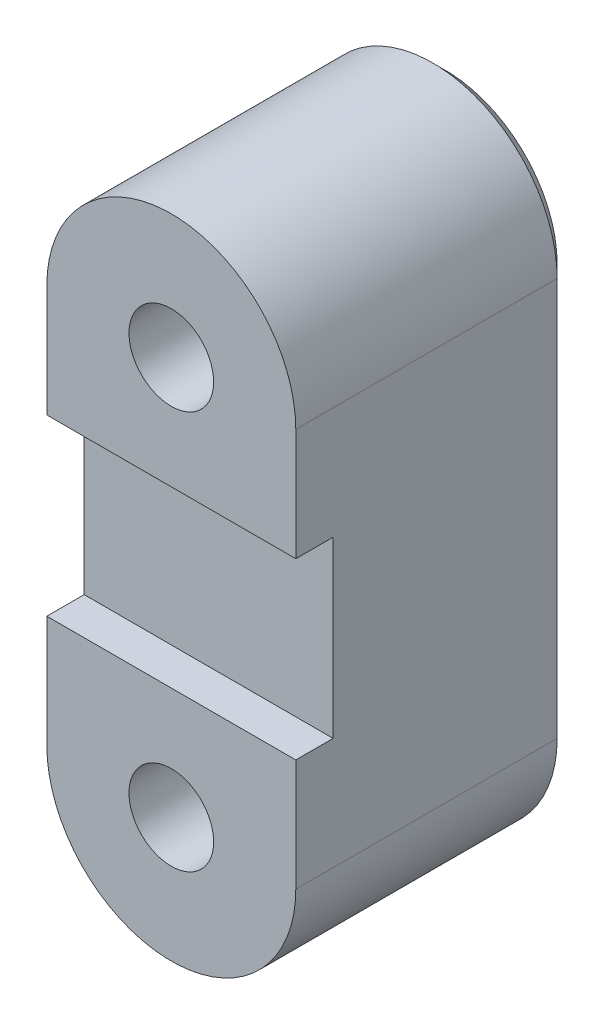
ISO-10303-21;
HEADER;
FILE_DESCRIPTION(('STEP AP214'),'2;1');
FILE_NAME('part.step','',(''),(''),'','','');
FILE_SCHEMA(('AUTOMOTIVE_DESIGN { 1 0 10303 214 1 1 1 1 }'));
ENDSEC;
DATA;
#1=APPLICATION_CONTEXT('core data for automotive mechanical design processes');
#2=APPLICATION_PROTOCOL_DEFINITION('international standard','automotive_design',2000,#1);
#3=PRODUCT_CONTEXT('',#1,'mechanical');
#4=PRODUCT('Part','Part','',(#3));
#5=PRODUCT_RELATED_PRODUCT_CATEGORY('part','',(#4));
#6=PRODUCT_DEFINITION_FORMATION('','',#4);
#7=PRODUCT_DEFINITION_CONTEXT('part definition',#1,'design');
#8=PRODUCT_DEFINITION('design','',#6,#7);
#9=PRODUCT_DEFINITION_SHAPE('','',#8);
#10=(LENGTH_UNIT() NAMED_UNIT(*) SI_UNIT(.MILLI.,.METRE.));
#11=(NAMED_UNIT(*) PLANE_ANGLE_UNIT() SI_UNIT($,.RADIAN.));
#12=(NAMED_UNIT(*) SI_UNIT($,.STERADIAN.) SOLID_ANGLE_UNIT());
#13=UNCERTAINTY_MEASURE_WITH_UNIT(LENGTH_MEASURE(1.E-05),#10,'distance_accuracy_value','');
#14=(GEOMETRIC_REPRESENTATION_CONTEXT(3) GLOBAL_UNCERTAINTY_ASSIGNED_CONTEXT((#13)) GLOBAL_UNIT_ASSIGNED_CONTEXT((#10,
#11,#12)) REPRESENTATION_CONTEXT('',''));
#15=CARTESIAN_POINT('',(0.,0.,0.));
#16=DIRECTION('',(0.,0.,1.));
#17=DIRECTION('',(1.,0.,0.));
#18=AXIS2_PLACEMENT_3D('',#15,#16,#17);
#19=CARTESIAN_POINT('',(0.,-8.,11.));
#20=DIRECTION('',(0.,0.,1.));
#21=DIRECTION('',(1.,0.,0.));
#22=AXIS2_PLACEMENT_3D('',#19,#20,#21);
#23=PLANE('',#22);
#24=DIRECTION('',(-1.,0.,0.));
#25=VECTOR('',#24,1.);
#26=CARTESIAN_POINT('',(-5.,3.5,11.));
#27=LINE('',#26,#25);
#28=CARTESIAN_POINT('',(5.,3.5,11.));
#29=VERTEX_POINT('',#28);
#30=CARTESIAN_POINT('',(-5.,3.5,11.));
#31=VERTEX_POINT('',#30);
#32=EDGE_CURVE('E134',#29,#31,#27,.T.);
#33=ORIENTED_EDGE('',*,*,#32,.F.);
#34=DIRECTION('',(0.,1.,0.));
#35=VECTOR('',#34,1.);
#36=CARTESIAN_POINT('',(5.,-8.,11.));
#37=LINE('',#36,#35);
#38=CARTESIAN_POINT('',(5.,8.,11.));
#39=VERTEX_POINT('',#38);
#40=EDGE_CURVE('E155',#29,#39,#37,.T.);
#41=ORIENTED_EDGE('',*,*,#40,.T.);
#42=CARTESIAN_POINT('',(0.,8.,11.));
#43=DIRECTION('',(0.,0.,1.));
#44=DIRECTION('',(1.,0.,0.));
#45=AXIS2_PLACEMENT_3D('',#42,#43,#44);
#46=CIRCLE('',#45,5.);
#47=CARTESIAN_POINT('',(-5.,8.,11.));
#48=VERTEX_POINT('',#47);
#49=EDGE_CURVE('E159',#39,#48,#46,.T.);
#50=ORIENTED_EDGE('',*,*,#49,.T.);
#51=DIRECTION('',(0.,-1.,0.));
#52=VECTOR('',#51,1.);
#53=CARTESIAN_POINT('',(-5.,-8.,11.));
#54=LINE('',#53,#52);
#55=EDGE_CURVE('E161',#48,#31,#54,.T.);
#56=ORIENTED_EDGE('',*,*,#55,.T.);
#57=EDGE_LOOP('',(#33,#41,#50,#56));
#58=FACE_BOUND('',#57,.T.);
#59=CARTESIAN_POINT('',(0.,8.,11.));
#60=DIRECTION('',(0.,0.,1.));
#61=DIRECTION('',(1.,0.,0.));
#62=AXIS2_PLACEMENT_3D('',#59,#60,#61);
#63=CIRCLE('',#62,1.7);
#64=CARTESIAN_POINT('',(1.7,8.,11.));
#65=VERTEX_POINT('',#64);
#66=EDGE_CURVE('E148',#65,#65,#63,.T.);
#67=ORIENTED_EDGE('',*,*,#66,.F.);
#68=EDGE_LOOP('',(#67));
#69=FACE_BOUND('',#68,.T.);
#70=ADVANCED_FACE('F34',(#58,#69),#23,.T.);
#71=DIRECTION('',(1.,0.,0.));
#72=VECTOR('',#71,1.);
#73=CARTESIAN_POINT('',(-5.,-3.5,11.));
#74=LINE('',#73,#72);
#75=CARTESIAN_POINT('',(-5.,-3.5,11.));
#76=VERTEX_POINT('',#75);
#77=CARTESIAN_POINT('',(5.,-3.5,11.));
#78=VERTEX_POINT('',#77);
#79=EDGE_CURVE('E206',#76,#78,#74,.T.);
#80=ORIENTED_EDGE('',*,*,#79,.F.);
#81=CARTESIAN_POINT('',(-5.,-8.,11.));
#82=VERTEX_POINT('',#81);
#83=EDGE_CURVE('E138',#76,#82,#54,.T.);
#84=ORIENTED_EDGE('',*,*,#83,.T.);
#85=CARTESIAN_POINT('',(0.,-8.,11.));
#86=DIRECTION('',(0.,0.,1.));
#87=DIRECTION('',(1.,0.,0.));
#88=AXIS2_PLACEMENT_3D('',#85,#86,#87);
#89=CIRCLE('',#88,5.);
#90=CARTESIAN_POINT('',(5.,-8.,11.));
#91=VERTEX_POINT('',#90);
#92=EDGE_CURVE('E152',#82,#91,#89,.T.);
#93=ORIENTED_EDGE('',*,*,#92,.T.);
#94=EDGE_CURVE('E156',#91,#78,#37,.T.);
#95=ORIENTED_EDGE('',*,*,#94,.T.);
#96=EDGE_LOOP('',(#80,#84,#93,#95));
#97=FACE_BOUND('',#96,.T.);
#98=CARTESIAN_POINT('',(0.,-8.,11.));
#99=DIRECTION('',(0.,0.,1.));
#100=DIRECTION('',(1.,0.,0.));
#101=AXIS2_PLACEMENT_3D('',#98,#99,#100);
#102=CIRCLE('',#101,1.7);
#103=CARTESIAN_POINT('',(1.7,-8.,11.));
#104=VERTEX_POINT('',#103);
#105=EDGE_CURVE('E145',#104,#104,#102,.T.);
#106=ORIENTED_EDGE('',*,*,#105,.F.);
#107=EDGE_LOOP('',(#106));
#108=FACE_BOUND('',#107,.T.);
#109=ADVANCED_FACE('F239',(#97,#108),#23,.T.);
#110=CARTESIAN_POINT('',(0.,-8.,0.));
#111=DIRECTION('',(0.,0.,1.));
#112=DIRECTION('',(1.,0.,0.));
#113=AXIS2_PLACEMENT_3D('',#110,#111,#112);
#114=PLANE('',#113);
#115=CARTESIAN_POINT('',(0.,8.,0.));
#116=DIRECTION('',(0.,0.,1.));
#117=DIRECTION('',(1.,0.,0.));
#118=AXIS2_PLACEMENT_3D('',#115,#116,#117);
#119=CIRCLE('',#118,4.5);
#120=CARTESIAN_POINT('',(-4.5,8.,0.));
#121=VERTEX_POINT('',#120);
#122=CARTESIAN_POINT('',(4.5,8.,0.));
#123=VERTEX_POINT('',#122);
#124=EDGE_CURVE('E182',#121,#123,#119,.F.);
#125=ORIENTED_EDGE('',*,*,#124,.T.);
#126=DIRECTION('',(0.,-1.,0.));
#127=VECTOR('',#126,1.);
#128=CARTESIAN_POINT('',(4.5,-8.,0.));
#129=LINE('',#128,#127);
#130=CARTESIAN_POINT('',(4.5,-8.,0.));
#131=VERTEX_POINT('',#130);
#132=EDGE_CURVE('E188',#123,#131,#129,.T.);
#133=ORIENTED_EDGE('',*,*,#132,.T.);
#134=CARTESIAN_POINT('',(0.,-8.,0.));
#135=DIRECTION('',(0.,0.,1.));
#136=DIRECTION('',(1.,0.,0.));
#137=AXIS2_PLACEMENT_3D('',#134,#135,#136);
#138=CIRCLE('',#137,4.5);
#139=CARTESIAN_POINT('',(-4.5,-8.,0.));
#140=VERTEX_POINT('',#139);
#141=EDGE_CURVE('E186',#131,#140,#138,.F.);
#142=ORIENTED_EDGE('',*,*,#141,.T.);
#143=DIRECTION('',(0.,1.,0.));
#144=VECTOR('',#143,1.);
#145=CARTESIAN_POINT('',(-4.5,-8.,0.));
#146=LINE('',#145,#144);
#147=EDGE_CURVE('E184',#140,#121,#146,.T.);
#148=ORIENTED_EDGE('',*,*,#147,.T.);
#149=EDGE_LOOP('',(#125,#133,#142,#148));
#150=FACE_BOUND('',#149,.T.);
#151=CARTESIAN_POINT('',(0.,-8.,0.));
#152=DIRECTION('',(0.,0.,1.));
#153=DIRECTION('',(1.,0.,0.));
#154=AXIS2_PLACEMENT_3D('',#151,#152,#153);
#155=CIRCLE('',#154,2.2);
#156=CARTESIAN_POINT('',(2.2,-8.,0.));
#157=VERTEX_POINT('',#156);
#158=EDGE_CURVE('E179',#157,#157,#155,.T.);
#159=ORIENTED_EDGE('',*,*,#158,.T.);
#160=EDGE_LOOP('',(#159));
#161=FACE_BOUND('',#160,.T.);
#162=CARTESIAN_POINT('',(0.,8.,0.));
#163=DIRECTION('',(0.,0.,1.));
#164=DIRECTION('',(1.,0.,0.));
#165=AXIS2_PLACEMENT_3D('',#162,#163,#164);
#166=CIRCLE('',#165,2.2);
#167=CARTESIAN_POINT('',(2.2,8.,0.));
#168=VERTEX_POINT('',#167);
#169=EDGE_CURVE('E176',#168,#168,#166,.T.);
#170=ORIENTED_EDGE('',*,*,#169,.T.);
#171=EDGE_LOOP('',(#170));
#172=FACE_BOUND('',#171,.T.);
#173=ADVANCED_FACE('F242',(#150,#161,#172),#114,.F.);
#174=CARTESIAN_POINT('',(0.,-8.,11.));
#175=DIRECTION('',(0.,0.,-1.));
#176=DIRECTION('',(-1.,0.,0.));
#177=AXIS2_PLACEMENT_3D('',#174,#175,#176);
#178=CYLINDRICAL_SURFACE('',#177,5.);
#179=DIRECTION('',(0.,0.,-1.));
#180=VECTOR('',#179,1.);
#181=CARTESIAN_POINT('',(-5.,-8.,11.));
#182=LINE('',#181,#180);
#183=CARTESIAN_POINT('',(-5.,-8.,0.5));
#184=VERTEX_POINT('',#183);
#185=EDGE_CURVE('E164',#82,#184,#182,.T.);
#186=ORIENTED_EDGE('',*,*,#185,.T.);
#187=CARTESIAN_POINT('',(0.,-8.,0.5));
#188=DIRECTION('',(0.,0.,1.));
#189=DIRECTION('',(1.,0.,0.));
#190=AXIS2_PLACEMENT_3D('',#187,#188,#189);
#191=CIRCLE('',#190,5.);
#192=CARTESIAN_POINT('',(5.,-8.,0.5));
#193=VERTEX_POINT('',#192);
#194=EDGE_CURVE('E191',#184,#193,#191,.T.);
#195=ORIENTED_EDGE('',*,*,#194,.T.);
#196=DIRECTION('',(0.,0.,-1.));
#197=VECTOR('',#196,1.);
#198=CARTESIAN_POINT('',(5.,-8.,11.));
#199=LINE('',#198,#197);
#200=EDGE_CURVE('E170',#91,#193,#199,.T.);
#201=ORIENTED_EDGE('',*,*,#200,.F.);
#202=ORIENTED_EDGE('',*,*,#92,.F.);
#203=EDGE_LOOP('',(#186,#195,#201,#202));
#204=FACE_BOUND('',#203,.T.);
#205=ADVANCED_FACE('F236',(#204),#178,.T.);
#206=CARTESIAN_POINT('',(5.,-8.,11.));
#207=DIRECTION('',(-1.,0.,0.));
#208=DIRECTION('',(0.,0.,1.));
#209=AXIS2_PLACEMENT_3D('',#206,#207,#208);
#210=PLANE('',#209);
#211=ORIENTED_EDGE('',*,*,#200,.T.);
#212=DIRECTION('',(0.,1.,0.));
#213=VECTOR('',#212,1.);
#214=CARTESIAN_POINT('',(5.,-8.,0.5));
#215=LINE('',#214,#213);
#216=CARTESIAN_POINT('',(5.,8.,0.5));
#217=VERTEX_POINT('',#216);
#218=EDGE_CURVE('E173',#193,#217,#215,.T.);
#219=ORIENTED_EDGE('',*,*,#218,.T.);
#220=DIRECTION('',(0.,0.,-1.));
#221=VECTOR('',#220,1.);
#222=CARTESIAN_POINT('',(5.,8.,11.));
#223=LINE('',#222,#221);
#224=EDGE_CURVE('E168',#39,#217,#223,.T.);
#225=ORIENTED_EDGE('',*,*,#224,.F.);
#226=ORIENTED_EDGE('',*,*,#40,.F.);
#227=DIRECTION('',(0.,0.,1.));
#228=VECTOR('',#227,1.);
#229=CARTESIAN_POINT('',(5.,3.5,9.5));
#230=LINE('',#229,#228);
#231=CARTESIAN_POINT('',(5.,3.5,9.5));
#232=VERTEX_POINT('',#231);
#233=EDGE_CURVE('E140',#232,#29,#230,.T.);
#234=ORIENTED_EDGE('',*,*,#233,.F.);
#235=DIRECTION('',(0.,1.,0.));
#236=VECTOR('',#235,1.);
#237=CARTESIAN_POINT('',(5.,-3.5,9.5));
#238=LINE('',#237,#236);
#239=CARTESIAN_POINT('',(5.,-3.5,9.5));
#240=VERTEX_POINT('',#239);
#241=EDGE_CURVE('E125',#240,#232,#238,.T.);
#242=ORIENTED_EDGE('',*,*,#241,.F.);
#243=DIRECTION('',(0.,0.,1.));
#244=VECTOR('',#243,1.);
#245=CARTESIAN_POINT('',(5.,-3.5,9.5));
#246=LINE('',#245,#244);
#247=EDGE_CURVE('E122',#240,#78,#246,.T.);
#248=ORIENTED_EDGE('',*,*,#247,.T.);
#249=ORIENTED_EDGE('',*,*,#94,.F.);
#250=EDGE_LOOP('',(#211,#219,#225,#226,#234,#242,#248,#249));
#251=FACE_BOUND('',#250,.T.);
#252=ADVANCED_FACE('F225',(#251),#210,.F.);
#253=CARTESIAN_POINT('',(0.,8.,11.));
#254=DIRECTION('',(0.,0.,-1.));
#255=DIRECTION('',(-1.,0.,0.));
#256=AXIS2_PLACEMENT_3D('',#253,#254,#255);
#257=CYLINDRICAL_SURFACE('',#256,5.);
#258=ORIENTED_EDGE('',*,*,#224,.T.);
#259=CARTESIAN_POINT('',(0.,8.,0.5));
#260=DIRECTION('',(0.,0.,1.));
#261=DIRECTION('',(1.,0.,0.));
#262=AXIS2_PLACEMENT_3D('',#259,#260,#261);
#263=CIRCLE('',#262,5.);
#264=CARTESIAN_POINT('',(-5.,8.,0.5));
#265=VERTEX_POINT('',#264);
#266=EDGE_CURVE('E51',#217,#265,#263,.T.);
#267=ORIENTED_EDGE('',*,*,#266,.T.);
#268=DIRECTION('',(0.,0.,-1.));
#269=VECTOR('',#268,1.);
#270=CARTESIAN_POINT('',(-5.,8.,11.));
#271=LINE('',#270,#269);
#272=EDGE_CURVE('E166',#48,#265,#271,.T.);
#273=ORIENTED_EDGE('',*,*,#272,.F.);
#274=ORIENTED_EDGE('',*,*,#49,.F.);
#275=EDGE_LOOP('',(#258,#267,#273,#274));
#276=FACE_BOUND('',#275,.T.);
#277=ADVANCED_FACE('F228',(#276),#257,.T.);
#278=CARTESIAN_POINT('',(-5.,-8.,11.));
#279=DIRECTION('',(1.,0.,0.));
#280=DIRECTION('',(0.,0.,-1.));
#281=AXIS2_PLACEMENT_3D('',#278,#279,#280);
#282=PLANE('',#281);
#283=ORIENTED_EDGE('',*,*,#272,.T.);
#284=DIRECTION('',(0.,-1.,0.));
#285=VECTOR('',#284,1.);
#286=CARTESIAN_POINT('',(-5.,-8.,0.5));
#287=LINE('',#286,#285);
#288=EDGE_CURVE('E58',#265,#184,#287,.T.);
#289=ORIENTED_EDGE('',*,*,#288,.T.);
#290=ORIENTED_EDGE('',*,*,#185,.F.);
#291=ORIENTED_EDGE('',*,*,#83,.F.);
#292=DIRECTION('',(0.,0.,1.));
#293=VECTOR('',#292,1.);
#294=CARTESIAN_POINT('',(-5.,-3.5,9.5));
#295=LINE('',#294,#293);
#296=CARTESIAN_POINT('',(-5.,-3.5,9.5));
#297=VERTEX_POINT('',#296);
#298=EDGE_CURVE('E119',#297,#76,#295,.T.);
#299=ORIENTED_EDGE('',*,*,#298,.F.);
#300=DIRECTION('',(0.,-1.,0.));
#301=VECTOR('',#300,1.);
#302=CARTESIAN_POINT('',(-5.,-3.5,9.5));
#303=LINE('',#302,#301);
#304=CARTESIAN_POINT('',(-5.,3.5,9.5));
#305=VERTEX_POINT('',#304);
#306=EDGE_CURVE('E126',#305,#297,#303,.T.);
#307=ORIENTED_EDGE('',*,*,#306,.F.);
#308=DIRECTION('',(0.,0.,1.));
#309=VECTOR('',#308,1.);
#310=CARTESIAN_POINT('',(-5.,3.5,9.5));
#311=LINE('',#310,#309);
#312=EDGE_CURVE('E149',#305,#31,#311,.T.);
#313=ORIENTED_EDGE('',*,*,#312,.T.);
#314=ORIENTED_EDGE('',*,*,#55,.F.);
#315=EDGE_LOOP('',(#283,#289,#290,#291,#299,#307,#313,#314));
#316=FACE_BOUND('',#315,.T.);
#317=ADVANCED_FACE('F137',(#316),#282,.F.);
#318=CARTESIAN_POINT('',(0.,8.,11.));
#319=DIRECTION('',(0.,0.,-1.));
#320=DIRECTION('',(-1.,0.,0.));
#321=AXIS2_PLACEMENT_3D('',#318,#319,#320);
#322=CYLINDRICAL_SURFACE('',#321,1.7);
#323=CARTESIAN_POINT('',(0.,8.,0.5));
#324=DIRECTION('',(0.,0.,1.));
#325=DIRECTION('',(1.,0.,0.));
#326=AXIS2_PLACEMENT_3D('',#323,#324,#325);
#327=CIRCLE('',#326,1.7);
#328=CARTESIAN_POINT('',(1.7,8.,0.5));
#329=VERTEX_POINT('',#328);
#330=EDGE_CURVE('E11',#329,#329,#327,.F.);
#331=ORIENTED_EDGE('',*,*,#330,.T.);
#332=EDGE_LOOP('',(#331));
#333=FACE_BOUND('',#332,.T.);
#334=ORIENTED_EDGE('',*,*,#66,.T.);
#335=EDGE_LOOP('',(#334));
#336=FACE_BOUND('',#335,.T.);
#337=ADVANCED_FACE('F248',(#333,#336),#322,.F.);
#338=CARTESIAN_POINT('',(0.,-8.,11.));
#339=DIRECTION('',(0.,0.,-1.));
#340=DIRECTION('',(-1.,0.,0.));
#341=AXIS2_PLACEMENT_3D('',#338,#339,#340);
#342=CYLINDRICAL_SURFACE('',#341,1.7);
#343=CARTESIAN_POINT('',(0.,-8.,0.5));
#344=DIRECTION('',(0.,0.,1.));
#345=DIRECTION('',(1.,0.,0.));
#346=AXIS2_PLACEMENT_3D('',#343,#344,#345);
#347=CIRCLE('',#346,1.7);
#348=CARTESIAN_POINT('',(1.7,-8.,0.5));
#349=VERTEX_POINT('',#348);
#350=EDGE_CURVE('E43',#349,#349,#347,.F.);
#351=ORIENTED_EDGE('',*,*,#350,.T.);
#352=EDGE_LOOP('',(#351));
#353=FACE_BOUND('',#352,.T.);
#354=ORIENTED_EDGE('',*,*,#105,.T.);
#355=EDGE_LOOP('',(#354));
#356=FACE_BOUND('',#355,.T.);
#357=ADVANCED_FACE('F246',(#353,#356),#342,.F.);
#358=CARTESIAN_POINT('',(-5.,3.5,9.5));
#359=DIRECTION('',(0.,1.,0.));
#360=DIRECTION('',(-1.,0.,0.));
#361=AXIS2_PLACEMENT_3D('',#358,#359,#360);
#362=PLANE('',#361);
#363=ORIENTED_EDGE('',*,*,#32,.T.);
#364=ORIENTED_EDGE('',*,*,#312,.F.);
#365=DIRECTION('',(-1.,0.,0.));
#366=VECTOR('',#365,1.);
#367=CARTESIAN_POINT('',(-5.,3.5,9.5));
#368=LINE('',#367,#366);
#369=EDGE_CURVE('E131',#232,#305,#368,.T.);
#370=ORIENTED_EDGE('',*,*,#369,.F.);
#371=ORIENTED_EDGE('',*,*,#233,.T.);
#372=EDGE_LOOP('',(#363,#364,#370,#371));
#373=FACE_BOUND('',#372,.T.);
#374=ADVANCED_FACE('F218',(#373),#362,.F.);
#375=CARTESIAN_POINT('',(-5.,-3.5,9.5));
#376=DIRECTION('',(0.,-1.,0.));
#377=DIRECTION('',(0.,0.,-1.));
#378=AXIS2_PLACEMENT_3D('',#375,#376,#377);
#379=PLANE('',#378);
#380=ORIENTED_EDGE('',*,*,#79,.T.);
#381=ORIENTED_EDGE('',*,*,#247,.F.);
#382=DIRECTION('',(1.,0.,0.));
#383=VECTOR('',#382,1.);
#384=CARTESIAN_POINT('',(-5.,-3.5,9.5));
#385=LINE('',#384,#383);
#386=EDGE_CURVE('E115',#297,#240,#385,.T.);
#387=ORIENTED_EDGE('',*,*,#386,.F.);
#388=ORIENTED_EDGE('',*,*,#298,.T.);
#389=EDGE_LOOP('',(#380,#381,#387,#388));
#390=FACE_BOUND('',#389,.T.);
#391=ADVANCED_FACE('F117',(#390),#379,.F.);
#392=CARTESIAN_POINT('',(0.,0.,9.5));
#393=DIRECTION('',(0.,0.,-1.));
#394=DIRECTION('',(-1.,0.,0.));
#395=AXIS2_PLACEMENT_3D('',#392,#393,#394);
#396=PLANE('',#395);
#397=ORIENTED_EDGE('',*,*,#306,.T.);
#398=ORIENTED_EDGE('',*,*,#386,.T.);
#399=ORIENTED_EDGE('',*,*,#241,.T.);
#400=ORIENTED_EDGE('',*,*,#369,.T.);
#401=EDGE_LOOP('',(#397,#398,#399,#400));
#402=FACE_BOUND('',#401,.T.);
#403=ADVANCED_FACE('F129',(#402),#396,.F.);
#404=CARTESIAN_POINT('',(-5.,-8.,0.5));
#405=DIRECTION('',(0.707106781186545,0.,0.70710678118655));
#406=DIRECTION('',(0.,-1.,0.));
#407=AXIS2_PLACEMENT_3D('',#404,#405,#406);
#408=PLANE('',#407);
#409=DIRECTION('',(-0.70710678118655,0.,0.707106781186545));
#410=VECTOR('',#409,1.);
#411=CARTESIAN_POINT('',(-4.5,8.,0.));
#412=LINE('',#411,#410);
#413=EDGE_CURVE('E200',#121,#265,#412,.T.);
#414=ORIENTED_EDGE('',*,*,#413,.F.);
#415=ORIENTED_EDGE('',*,*,#147,.F.);
#416=DIRECTION('',(0.70710678118655,0.,-0.707106781186545));
#417=VECTOR('',#416,1.);
#418=CARTESIAN_POINT('',(-5.,-8.,0.5));
#419=LINE('',#418,#417);
#420=EDGE_CURVE('E38',#184,#140,#419,.T.);
#421=ORIENTED_EDGE('',*,*,#420,.F.);
#422=ORIENTED_EDGE('',*,*,#288,.F.);
#423=EDGE_LOOP('',(#414,#415,#421,#422));
#424=FACE_BOUND('',#423,.T.);
#425=ADVANCED_FACE('F230',(#424),#408,.F.);
#426=CARTESIAN_POINT('',(0.,-8.,0.5));
#427=DIRECTION('',(0.,0.,1.));
#428=DIRECTION('',(1.,0.,0.));
#429=AXIS2_PLACEMENT_3D('',#426,#427,#428);
#430=CONICAL_SURFACE('',#429,5.,0.785398163397452);
#431=ORIENTED_EDGE('',*,*,#420,.T.);
#432=ORIENTED_EDGE('',*,*,#141,.F.);
#433=DIRECTION('',(-0.70710678118655,0.,-0.707106781186545));
#434=VECTOR('',#433,1.);
#435=CARTESIAN_POINT('',(5.,-8.,0.5));
#436=LINE('',#435,#434);
#437=EDGE_CURVE('E199',#193,#131,#436,.T.);
#438=ORIENTED_EDGE('',*,*,#437,.F.);
#439=ORIENTED_EDGE('',*,*,#194,.F.);
#440=EDGE_LOOP('',(#431,#432,#438,#439));
#441=FACE_BOUND('',#440,.T.);
#442=ADVANCED_FACE('F233',(#441),#430,.T.);
#443=CARTESIAN_POINT('',(0.,8.,0.5));
#444=DIRECTION('',(0.,0.,1.));
#445=DIRECTION('',(1.,0.,0.));
#446=AXIS2_PLACEMENT_3D('',#443,#444,#445);
#447=CONICAL_SURFACE('',#446,5.,0.785398163397452);
#448=ORIENTED_EDGE('',*,*,#413,.T.);
#449=ORIENTED_EDGE('',*,*,#266,.F.);
#450=DIRECTION('',(0.70710678118655,0.,0.707106781186545));
#451=VECTOR('',#450,1.);
#452=CARTESIAN_POINT('',(4.5,8.,0.));
#453=LINE('',#452,#451);
#454=EDGE_CURVE('E197',#123,#217,#453,.T.);
#455=ORIENTED_EDGE('',*,*,#454,.F.);
#456=ORIENTED_EDGE('',*,*,#124,.F.);
#457=EDGE_LOOP('',(#448,#449,#455,#456));
#458=FACE_BOUND('',#457,.T.);
#459=ADVANCED_FACE('F278',(#458),#447,.T.);
#460=CARTESIAN_POINT('',(5.,-8.,0.5));
#461=DIRECTION('',(-0.707106781186545,0.,0.70710678118655));
#462=DIRECTION('',(0.,1.,0.));
#463=AXIS2_PLACEMENT_3D('',#460,#461,#462);
#464=PLANE('',#463);
#465=ORIENTED_EDGE('',*,*,#437,.T.);
#466=ORIENTED_EDGE('',*,*,#132,.F.);
#467=ORIENTED_EDGE('',*,*,#454,.T.);
#468=ORIENTED_EDGE('',*,*,#218,.F.);
#469=EDGE_LOOP('',(#465,#466,#467,#468));
#470=FACE_BOUND('',#469,.T.);
#471=ADVANCED_FACE('F274',(#470),#464,.F.);
#472=CARTESIAN_POINT('',(0.,-8.,0.));
#473=DIRECTION('',(0.,0.,-1.));
#474=DIRECTION('',(-1.,0.,0.));
#475=AXIS2_PLACEMENT_3D('',#472,#473,#474);
#476=CONICAL_SURFACE('',#475,2.2,0.785398163397445);
#477=ORIENTED_EDGE('',*,*,#350,.F.);
#478=EDGE_LOOP('',(#477));
#479=FACE_BOUND('',#478,.T.);
#480=ORIENTED_EDGE('',*,*,#158,.F.);
#481=EDGE_LOOP('',(#480));
#482=FACE_BOUND('',#481,.T.);
#483=ADVANCED_FACE('F277',(#479,#482),#476,.F.);
#484=CARTESIAN_POINT('',(0.,8.,0.));
#485=DIRECTION('',(0.,0.,-1.));
#486=DIRECTION('',(-1.,0.,0.));
#487=AXIS2_PLACEMENT_3D('',#484,#485,#486);
#488=CONICAL_SURFACE('',#487,2.2,0.785398163397445);
#489=ORIENTED_EDGE('',*,*,#330,.F.);
#490=EDGE_LOOP('',(#489));
#491=FACE_BOUND('',#490,.T.);
#492=ORIENTED_EDGE('',*,*,#169,.F.);
#493=EDGE_LOOP('',(#492));
#494=FACE_BOUND('',#493,.T.);
#495=ADVANCED_FACE('F36',(#491,#494),#488,.F.);
#496=CLOSED_SHELL('',(#70,#109,#173,#205,#252,#277,#317,#337,#357,#374,#391,#403,#425,#442,#459,
#471,#483,#495));
#497=MANIFOLD_SOLID_BREP('B2',#496);
#498=ADVANCED_BREP_SHAPE_REPRESENTATION('',(#18,#497),#14);
#499=SHAPE_DEFINITION_REPRESENTATION(#9,#498);
ENDSEC;
END-ISO-10303-21;
